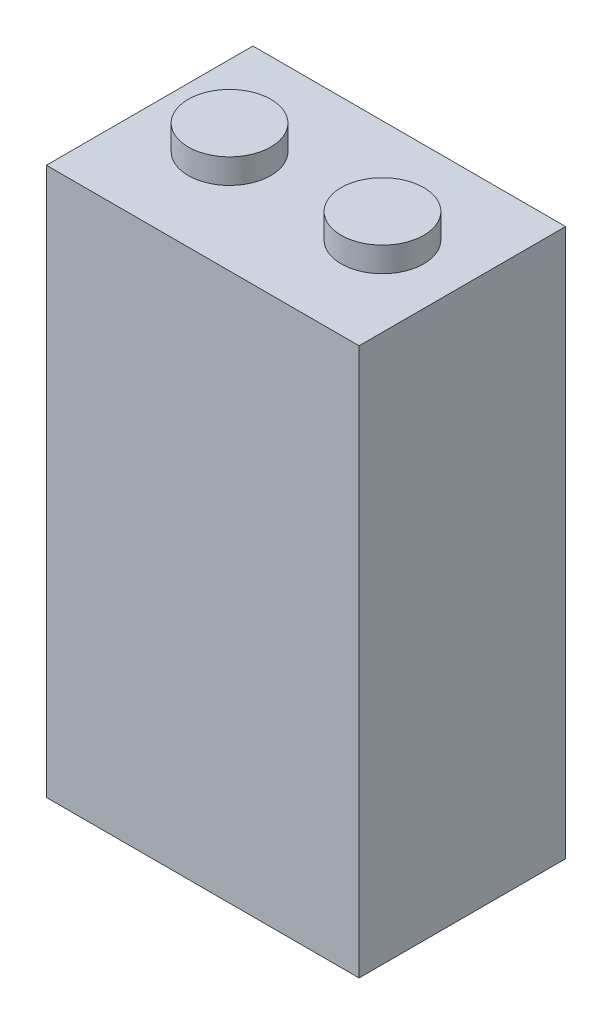
ISO-10303-21;
HEADER;
FILE_DESCRIPTION(('STEP AP214'),'2;1');
FILE_NAME('part.step','',(''),(''),'','','');
FILE_SCHEMA(('AUTOMOTIVE_DESIGN { 1 0 10303 214 1 1 1 1 }'));
ENDSEC;
DATA;
#1=APPLICATION_CONTEXT('core data for automotive mechanical design processes');
#2=APPLICATION_PROTOCOL_DEFINITION('international standard','automotive_design',2000,#1);
#3=PRODUCT_CONTEXT('',#1,'mechanical');
#4=PRODUCT('Part','Part','',(#3));
#5=PRODUCT_RELATED_PRODUCT_CATEGORY('part','',(#4));
#6=PRODUCT_DEFINITION_FORMATION('','',#4);
#7=PRODUCT_DEFINITION_CONTEXT('part definition',#1,'design');
#8=PRODUCT_DEFINITION('design','',#6,#7);
#9=PRODUCT_DEFINITION_SHAPE('','',#8);
#10=(LENGTH_UNIT() NAMED_UNIT(*) SI_UNIT(.MILLI.,.METRE.));
#11=(NAMED_UNIT(*) PLANE_ANGLE_UNIT() SI_UNIT($,.RADIAN.));
#12=(NAMED_UNIT(*) SI_UNIT($,.STERADIAN.) SOLID_ANGLE_UNIT());
#13=UNCERTAINTY_MEASURE_WITH_UNIT(LENGTH_MEASURE(1.E-05),#10,'distance_accuracy_value','');
#14=(GEOMETRIC_REPRESENTATION_CONTEXT(3) GLOBAL_UNCERTAINTY_ASSIGNED_CONTEXT((#13)) GLOBAL_UNIT_ASSIGNED_CONTEXT((#10,
#11,#12)) REPRESENTATION_CONTEXT('',''));
#15=CARTESIAN_POINT('',(0.,0.,0.));
#16=DIRECTION('',(0.,0.,1.));
#17=DIRECTION('',(1.,0.,0.));
#18=AXIS2_PLACEMENT_3D('',#15,#16,#17);
#19=CARTESIAN_POINT('',(13.25,46.4,8.75));
#20=DIRECTION('',(-1.,0.,0.));
#21=DIRECTION('',(0.,0.,1.));
#22=AXIS2_PLACEMENT_3D('',#19,#20,#21);
#23=PLANE('',#22);
#24=DIRECTION('',(0.,0.,-1.));
#25=VECTOR('',#24,1.);
#26=CARTESIAN_POINT('',(13.25,0.,8.75));
#27=LINE('',#26,#25);
#28=CARTESIAN_POINT('',(13.25,0.,8.75));
#29=VERTEX_POINT('',#28);
#30=CARTESIAN_POINT('',(13.25,0.,-8.75));
#31=VERTEX_POINT('',#30);
#32=EDGE_CURVE('E111',#29,#31,#27,.T.);
#33=ORIENTED_EDGE('',*,*,#32,.T.);
#34=DIRECTION('',(0.,-1.,0.));
#35=VECTOR('',#34,1.);
#36=CARTESIAN_POINT('',(13.25,46.4,-8.75));
#37=LINE('',#36,#35);
#38=CARTESIAN_POINT('',(13.25,46.4,-8.75));
#39=VERTEX_POINT('',#38);
#40=EDGE_CURVE('E100',#39,#31,#37,.T.);
#41=ORIENTED_EDGE('',*,*,#40,.F.);
#42=DIRECTION('',(0.,0.,-1.));
#43=VECTOR('',#42,1.);
#44=CARTESIAN_POINT('',(13.25,46.4,8.75));
#45=LINE('',#44,#43);
#46=CARTESIAN_POINT('',(13.25,46.4,8.75));
#47=VERTEX_POINT('',#46);
#48=EDGE_CURVE('E92',#47,#39,#45,.T.);
#49=ORIENTED_EDGE('',*,*,#48,.F.);
#50=DIRECTION('',(0.,-1.,0.));
#51=VECTOR('',#50,1.);
#52=CARTESIAN_POINT('',(13.25,46.4,8.75));
#53=LINE('',#52,#51);
#54=EDGE_CURVE('E107',#47,#29,#53,.T.);
#55=ORIENTED_EDGE('',*,*,#54,.T.);
#56=EDGE_LOOP('',(#33,#41,#49,#55));
#57=FACE_BOUND('',#56,.T.);
#58=ADVANCED_FACE('F39',(#57),#23,.F.);
#59=CARTESIAN_POINT('',(-13.25,46.4,-8.75));
#60=DIRECTION('',(0.,0.,1.));
#61=DIRECTION('',(1.,0.,0.));
#62=AXIS2_PLACEMENT_3D('',#59,#60,#61);
#63=PLANE('',#62);
#64=DIRECTION('',(-1.,0.,0.));
#65=VECTOR('',#64,1.);
#66=CARTESIAN_POINT('',(-13.25,0.,-8.75));
#67=LINE('',#66,#65);
#68=CARTESIAN_POINT('',(-13.25,0.,-8.75));
#69=VERTEX_POINT('',#68);
#70=EDGE_CURVE('E98',#31,#69,#67,.T.);
#71=ORIENTED_EDGE('',*,*,#70,.T.);
#72=DIRECTION('',(0.,-1.,0.));
#73=VECTOR('',#72,1.);
#74=CARTESIAN_POINT('',(-13.25,46.4,-8.75));
#75=LINE('',#74,#73);
#76=CARTESIAN_POINT('',(-13.25,46.4,-8.75));
#77=VERTEX_POINT('',#76);
#78=EDGE_CURVE('E96',#77,#69,#75,.T.);
#79=ORIENTED_EDGE('',*,*,#78,.F.);
#80=DIRECTION('',(-1.,0.,0.));
#81=VECTOR('',#80,1.);
#82=CARTESIAN_POINT('',(-13.25,46.4,-8.75));
#83=LINE('',#82,#81);
#84=EDGE_CURVE('E87',#39,#77,#83,.T.);
#85=ORIENTED_EDGE('',*,*,#84,.F.);
#86=ORIENTED_EDGE('',*,*,#40,.T.);
#87=EDGE_LOOP('',(#71,#79,#85,#86));
#88=FACE_BOUND('',#87,.T.);
#89=ADVANCED_FACE('F97',(#88),#63,.F.);
#90=CARTESIAN_POINT('',(-13.25,46.4,8.75));
#91=DIRECTION('',(1.,0.,0.));
#92=DIRECTION('',(0.,0.,-1.));
#93=AXIS2_PLACEMENT_3D('',#90,#91,#92);
#94=PLANE('',#93);
#95=DIRECTION('',(0.,0.,1.));
#96=VECTOR('',#95,1.);
#97=CARTESIAN_POINT('',(-13.25,0.,8.75));
#98=LINE('',#97,#96);
#99=CARTESIAN_POINT('',(-13.25,0.,8.75));
#100=VERTEX_POINT('',#99);
#101=EDGE_CURVE('E73',#69,#100,#98,.T.);
#102=ORIENTED_EDGE('',*,*,#101,.T.);
#103=DIRECTION('',(0.,-1.,0.));
#104=VECTOR('',#103,1.);
#105=CARTESIAN_POINT('',(-13.25,46.4,8.75));
#106=LINE('',#105,#104);
#107=CARTESIAN_POINT('',(-13.25,46.4,8.75));
#108=VERTEX_POINT('',#107);
#109=EDGE_CURVE('E101',#108,#100,#106,.T.);
#110=ORIENTED_EDGE('',*,*,#109,.F.);
#111=DIRECTION('',(0.,0.,1.));
#112=VECTOR('',#111,1.);
#113=CARTESIAN_POINT('',(-13.25,46.4,8.75));
#114=LINE('',#113,#112);
#115=EDGE_CURVE('E90',#77,#108,#114,.T.);
#116=ORIENTED_EDGE('',*,*,#115,.F.);
#117=ORIENTED_EDGE('',*,*,#78,.T.);
#118=EDGE_LOOP('',(#102,#110,#116,#117));
#119=FACE_BOUND('',#118,.T.);
#120=ADVANCED_FACE('F103',(#119),#94,.F.);
#121=CARTESIAN_POINT('',(-13.25,46.4,8.75));
#122=DIRECTION('',(0.,0.,-1.));
#123=DIRECTION('',(-1.,0.,0.));
#124=AXIS2_PLACEMENT_3D('',#121,#122,#123);
#125=PLANE('',#124);
#126=DIRECTION('',(1.,0.,0.));
#127=VECTOR('',#126,1.);
#128=CARTESIAN_POINT('',(-13.25,0.,8.75));
#129=LINE('',#128,#127);
#130=EDGE_CURVE('E79',#100,#29,#129,.T.);
#131=ORIENTED_EDGE('',*,*,#130,.T.);
#132=ORIENTED_EDGE('',*,*,#54,.F.);
#133=DIRECTION('',(1.,0.,0.));
#134=VECTOR('',#133,1.);
#135=CARTESIAN_POINT('',(-13.25,46.4,8.75));
#136=LINE('',#135,#134);
#137=EDGE_CURVE('E56',#108,#47,#136,.T.);
#138=ORIENTED_EDGE('',*,*,#137,.F.);
#139=ORIENTED_EDGE('',*,*,#109,.T.);
#140=EDGE_LOOP('',(#131,#132,#138,#139));
#141=FACE_BOUND('',#140,.T.);
#142=ADVANCED_FACE('F135',(#141),#125,.F.);
#143=CARTESIAN_POINT('',(0.,46.4,0.));
#144=DIRECTION('',(0.,-1.,0.));
#145=DIRECTION('',(0.,0.,-1.));
#146=AXIS2_PLACEMENT_3D('',#143,#144,#145);
#147=PLANE('',#146);
#148=CARTESIAN_POINT('',(6.48,46.4,0.));
#149=DIRECTION('',(0.,-1.,0.));
#150=DIRECTION('',(0.,0.,-1.));
#151=AXIS2_PLACEMENT_3D('',#148,#149,#150);
#152=CIRCLE('',#151,3.5);
#153=CARTESIAN_POINT('',(6.48,46.4,-3.5));
#154=VERTEX_POINT('',#153);
#155=EDGE_CURVE('E11',#154,#154,#152,.F.);
#156=ORIENTED_EDGE('',*,*,#155,.F.);
#157=EDGE_LOOP('',(#156));
#158=FACE_BOUND('',#157,.T.);
#159=CARTESIAN_POINT('',(-6.48,46.4,0.));
#160=DIRECTION('',(0.,-1.,0.));
#161=DIRECTION('',(0.,0.,-1.));
#162=AXIS2_PLACEMENT_3D('',#159,#160,#161);
#163=CIRCLE('',#162,3.5);
#164=CARTESIAN_POINT('',(-6.48,46.4,-3.5));
#165=VERTEX_POINT('',#164);
#166=EDGE_CURVE('E48',#165,#165,#163,.F.);
#167=ORIENTED_EDGE('',*,*,#166,.F.);
#168=EDGE_LOOP('',(#167));
#169=FACE_BOUND('',#168,.T.);
#170=ORIENTED_EDGE('',*,*,#48,.T.);
#171=ORIENTED_EDGE('',*,*,#84,.T.);
#172=ORIENTED_EDGE('',*,*,#115,.T.);
#173=ORIENTED_EDGE('',*,*,#137,.T.);
#174=EDGE_LOOP('',(#170,#171,#172,#173));
#175=FACE_BOUND('',#174,.T.);
#176=ADVANCED_FACE('F88',(#158,#169,#175),#147,.F.);
#177=CARTESIAN_POINT('',(0.,0.,0.));
#178=DIRECTION('',(0.,-1.,0.));
#179=DIRECTION('',(0.,0.,-1.));
#180=AXIS2_PLACEMENT_3D('',#177,#178,#179);
#181=PLANE('',#180);
#182=ORIENTED_EDGE('',*,*,#32,.F.);
#183=ORIENTED_EDGE('',*,*,#130,.F.);
#184=ORIENTED_EDGE('',*,*,#101,.F.);
#185=ORIENTED_EDGE('',*,*,#70,.F.);
#186=EDGE_LOOP('',(#182,#183,#184,#185));
#187=FACE_BOUND('',#186,.T.);
#188=ADVANCED_FACE('F134',(#187),#181,.T.);
#189=CARTESIAN_POINT('',(-6.48,48.5,0.));
#190=DIRECTION('',(0.,-1.,0.));
#191=DIRECTION('',(0.,0.,-1.));
#192=AXIS2_PLACEMENT_3D('',#189,#190,#191);
#193=CYLINDRICAL_SURFACE('',#192,3.5);
#194=CARTESIAN_POINT('',(-6.48,48.5,0.));
#195=DIRECTION('',(0.,1.,0.));
#196=DIRECTION('',(0.,0.,1.));
#197=AXIS2_PLACEMENT_3D('',#194,#195,#196);
#198=CIRCLE('',#197,3.5);
#199=CARTESIAN_POINT('',(-6.48,48.5,3.5));
#200=VERTEX_POINT('',#199);
#201=EDGE_CURVE('E115',#200,#200,#198,.T.);
#202=ORIENTED_EDGE('',*,*,#201,.F.);
#203=EDGE_LOOP('',(#202));
#204=FACE_BOUND('',#203,.T.);
#205=ORIENTED_EDGE('',*,*,#166,.T.);
#206=EDGE_LOOP('',(#205));
#207=FACE_BOUND('',#206,.T.);
#208=ADVANCED_FACE('F131',(#204,#207),#193,.T.);
#209=CARTESIAN_POINT('',(-6.48,48.5,0.));
#210=DIRECTION('',(0.,1.,0.));
#211=DIRECTION('',(0.,0.,1.));
#212=AXIS2_PLACEMENT_3D('',#209,#210,#211);
#213=PLANE('',#212);
#214=ORIENTED_EDGE('',*,*,#201,.T.);
#215=EDGE_LOOP('',(#214));
#216=FACE_BOUND('',#215,.T.);
#217=ADVANCED_FACE('F168',(#216),#213,.T.);
#218=CARTESIAN_POINT('',(6.48,48.5,0.));
#219=DIRECTION('',(0.,-1.,0.));
#220=DIRECTION('',(0.,0.,-1.));
#221=AXIS2_PLACEMENT_3D('',#218,#219,#220);
#222=CYLINDRICAL_SURFACE('',#221,3.5);
#223=CARTESIAN_POINT('',(6.48,48.5,0.));
#224=DIRECTION('',(0.,1.,0.));
#225=DIRECTION('',(0.,0.,1.));
#226=AXIS2_PLACEMENT_3D('',#223,#224,#225);
#227=CIRCLE('',#226,3.5);
#228=CARTESIAN_POINT('',(6.48,48.5,3.5));
#229=VERTEX_POINT('',#228);
#230=EDGE_CURVE('E158',#229,#229,#227,.T.);
#231=ORIENTED_EDGE('',*,*,#230,.F.);
#232=EDGE_LOOP('',(#231));
#233=FACE_BOUND('',#232,.T.);
#234=ORIENTED_EDGE('',*,*,#155,.T.);
#235=EDGE_LOOP('',(#234));
#236=FACE_BOUND('',#235,.T.);
#237=ADVANCED_FACE('F165',(#233,#236),#222,.T.);
#238=CARTESIAN_POINT('',(6.48,48.5,0.));
#239=DIRECTION('',(0.,1.,0.));
#240=DIRECTION('',(0.,0.,1.));
#241=AXIS2_PLACEMENT_3D('',#238,#239,#240);
#242=PLANE('',#241);
#243=ORIENTED_EDGE('',*,*,#230,.T.);
#244=EDGE_LOOP('',(#243));
#245=FACE_BOUND('',#244,.T.);
#246=ADVANCED_FACE('F163',(#245),#242,.T.);
#247=CLOSED_SHELL('',(#58,#89,#120,#142,#176,#188,#208,#217,#237,#246));
#248=MANIFOLD_SOLID_BREP('B2',#247);
#249=ADVANCED_BREP_SHAPE_REPRESENTATION('',(#18,#248),#14);
#250=SHAPE_DEFINITION_REPRESENTATION(#9,#249);
ENDSEC;
END-ISO-10303-21;
